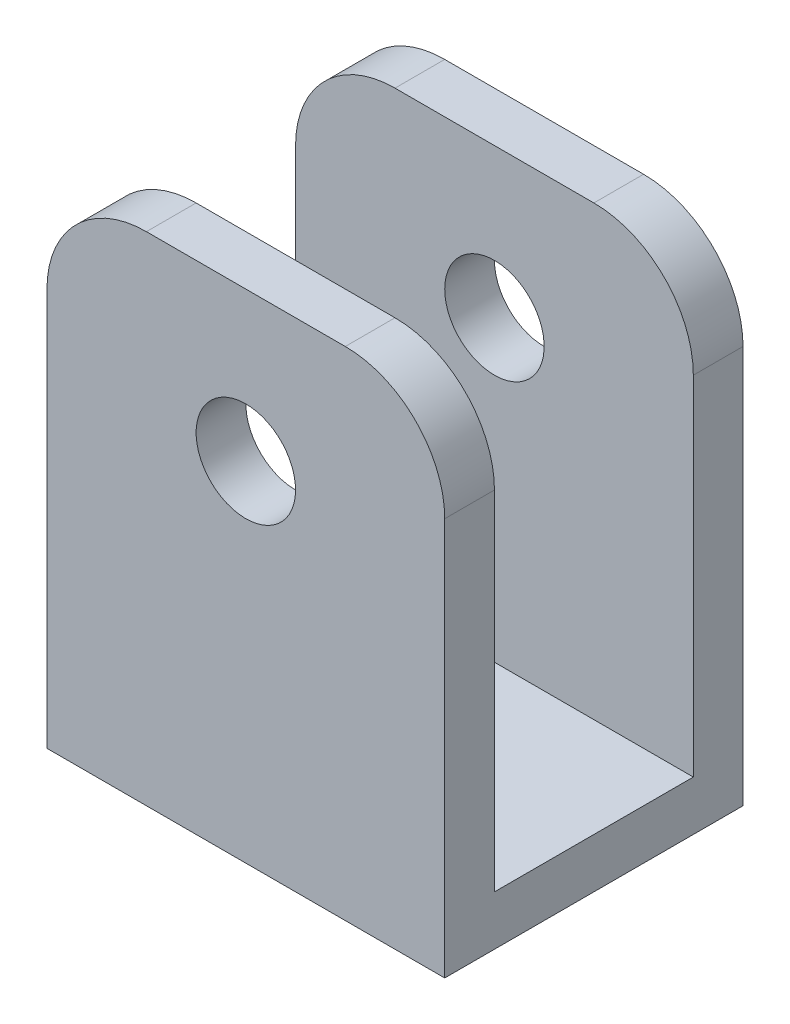
ISO-10303-21;
HEADER;
FILE_DESCRIPTION(('STEP AP214'),'2;1');
FILE_NAME('part.step','',(''),(''),'','','');
FILE_SCHEMA(('AUTOMOTIVE_DESIGN { 1 0 10303 214 1 1 1 1 }'));
ENDSEC;
DATA;
#1=APPLICATION_CONTEXT('core data for automotive mechanical design processes');
#2=APPLICATION_PROTOCOL_DEFINITION('international standard','automotive_design',2000,#1);
#3=PRODUCT_CONTEXT('',#1,'mechanical');
#4=PRODUCT('Part','Part','',(#3));
#5=PRODUCT_RELATED_PRODUCT_CATEGORY('part','',(#4));
#6=PRODUCT_DEFINITION_FORMATION('','',#4);
#7=PRODUCT_DEFINITION_CONTEXT('part definition',#1,'design');
#8=PRODUCT_DEFINITION('design','',#6,#7);
#9=PRODUCT_DEFINITION_SHAPE('','',#8);
#10=(LENGTH_UNIT() NAMED_UNIT(*) SI_UNIT(.MILLI.,.METRE.));
#11=(NAMED_UNIT(*) PLANE_ANGLE_UNIT() SI_UNIT($,.RADIAN.));
#12=(NAMED_UNIT(*) SI_UNIT($,.STERADIAN.) SOLID_ANGLE_UNIT());
#13=UNCERTAINTY_MEASURE_WITH_UNIT(LENGTH_MEASURE(1.E-05),#10,'distance_accuracy_value','');
#14=(GEOMETRIC_REPRESENTATION_CONTEXT(3) GLOBAL_UNCERTAINTY_ASSIGNED_CONTEXT((#13)) GLOBAL_UNIT_ASSIGNED_CONTEXT((#10,
#11,#12)) REPRESENTATION_CONTEXT('',''));
#15=CARTESIAN_POINT('',(0.,0.,0.));
#16=DIRECTION('',(0.,0.,1.));
#17=DIRECTION('',(1.,0.,0.));
#18=AXIS2_PLACEMENT_3D('',#15,#16,#17);
#19=CARTESIAN_POINT('',(-10.,5.,5.));
#20=DIRECTION('',(0.,0.,-1.));
#21=DIRECTION('',(-1.,0.,0.));
#22=AXIS2_PLACEMENT_3D('',#19,#20,#21);
#23=PLANE('',#22);
#24=DIRECTION('',(0.,-1.,0.));
#25=VECTOR('',#24,1.);
#26=CARTESIAN_POINT('',(-20.,-35.,5.));
#27=LINE('',#26,#25);
#28=CARTESIAN_POINT('',(-20.,5.,5.));
#29=VERTEX_POINT('',#28);
#30=CARTESIAN_POINT('',(-20.,-35.,5.));
#31=VERTEX_POINT('',#30);
#32=EDGE_CURVE('E139',#29,#31,#27,.T.);
#33=ORIENTED_EDGE('',*,*,#32,.T.);
#34=DIRECTION('',(1.,0.,0.));
#35=VECTOR('',#34,1.);
#36=CARTESIAN_POINT('',(-20.,-35.,5.));
#37=LINE('',#36,#35);
#38=CARTESIAN_POINT('',(20.,-35.,5.));
#39=VERTEX_POINT('',#38);
#40=EDGE_CURVE('E92',#31,#39,#37,.T.);
#41=ORIENTED_EDGE('',*,*,#40,.T.);
#42=DIRECTION('',(0.,1.,0.));
#43=VECTOR('',#42,1.);
#44=CARTESIAN_POINT('',(20.,-35.,5.));
#45=LINE('',#44,#43);
#46=CARTESIAN_POINT('',(20.,5.,5.));
#47=VERTEX_POINT('',#46);
#48=EDGE_CURVE('E109',#39,#47,#45,.T.);
#49=ORIENTED_EDGE('',*,*,#48,.T.);
#50=CARTESIAN_POINT('',(10.,5.,5.));
#51=DIRECTION('',(0.,0.,1.));
#52=DIRECTION('',(-1.,0.,0.));
#53=AXIS2_PLACEMENT_3D('',#50,#51,#52);
#54=CIRCLE('',#53,10.);
#55=CARTESIAN_POINT('',(10.,15.,5.));
#56=VERTEX_POINT('',#55);
#57=EDGE_CURVE('E102',#47,#56,#54,.T.);
#58=ORIENTED_EDGE('',*,*,#57,.T.);
#59=DIRECTION('',(-1.,0.,0.));
#60=VECTOR('',#59,1.);
#61=CARTESIAN_POINT('',(-10.,15.,5.));
#62=LINE('',#61,#60);
#63=CARTESIAN_POINT('',(-10.,15.,5.));
#64=VERTEX_POINT('',#63);
#65=EDGE_CURVE('E106',#56,#64,#62,.T.);
#66=ORIENTED_EDGE('',*,*,#65,.T.);
#67=CARTESIAN_POINT('',(-10.,5.,5.));
#68=DIRECTION('',(0.,0.,1.));
#69=DIRECTION('',(-1.,0.,0.));
#70=AXIS2_PLACEMENT_3D('',#67,#68,#69);
#71=CIRCLE('',#70,10.);
#72=EDGE_CURVE('E63',#64,#29,#71,.T.);
#73=ORIENTED_EDGE('',*,*,#72,.T.);
#74=EDGE_LOOP('',(#33,#41,#49,#58,#66,#73));
#75=FACE_BOUND('',#74,.T.);
#76=CARTESIAN_POINT('',(0.,0.,5.));
#77=DIRECTION('',(0.,0.,1.));
#78=DIRECTION('',(1.,0.,0.));
#79=AXIS2_PLACEMENT_3D('',#76,#77,#78);
#80=CIRCLE('',#79,5.);
#81=CARTESIAN_POINT('',(5.,0.,5.));
#82=VERTEX_POINT('',#81);
#83=EDGE_CURVE('E133',#82,#82,#80,.T.);
#84=ORIENTED_EDGE('',*,*,#83,.F.);
#85=EDGE_LOOP('',(#84));
#86=FACE_BOUND('',#85,.T.);
#87=ADVANCED_FACE('F39',(#75,#86),#23,.F.);
#88=CARTESIAN_POINT('',(-10.,5.,0.));
#89=DIRECTION('',(0.,0.,-1.));
#90=DIRECTION('',(-1.,0.,0.));
#91=AXIS2_PLACEMENT_3D('',#88,#89,#90);
#92=PLANE('',#91);
#93=DIRECTION('',(1.,0.,0.));
#94=VECTOR('',#93,1.);
#95=CARTESIAN_POINT('',(20.,-30.,0.));
#96=LINE('',#95,#94);
#97=CARTESIAN_POINT('',(-20.,-30.,0.));
#98=VERTEX_POINT('',#97);
#99=CARTESIAN_POINT('',(20.,-30.,0.));
#100=VERTEX_POINT('',#99);
#101=EDGE_CURVE('E54',#98,#100,#96,.T.);
#102=ORIENTED_EDGE('',*,*,#101,.F.);
#103=DIRECTION('',(0.,-1.,0.));
#104=VECTOR('',#103,1.);
#105=CARTESIAN_POINT('',(-20.,-35.,0.));
#106=LINE('',#105,#104);
#107=CARTESIAN_POINT('',(-20.,5.,0.));
#108=VERTEX_POINT('',#107);
#109=EDGE_CURVE('E130',#108,#98,#106,.T.);
#110=ORIENTED_EDGE('',*,*,#109,.F.);
#111=CARTESIAN_POINT('',(-10.,5.,0.));
#112=DIRECTION('',(0.,0.,1.));
#113=DIRECTION('',(-1.,0.,0.));
#114=AXIS2_PLACEMENT_3D('',#111,#112,#113);
#115=CIRCLE('',#114,10.);
#116=CARTESIAN_POINT('',(-10.,15.,0.));
#117=VERTEX_POINT('',#116);
#118=EDGE_CURVE('E84',#117,#108,#115,.T.);
#119=ORIENTED_EDGE('',*,*,#118,.F.);
#120=DIRECTION('',(-1.,0.,0.));
#121=VECTOR('',#120,1.);
#122=CARTESIAN_POINT('',(-10.,15.,0.));
#123=LINE('',#122,#121);
#124=CARTESIAN_POINT('',(10.,15.,0.));
#125=VERTEX_POINT('',#124);
#126=EDGE_CURVE('E136',#125,#117,#123,.T.);
#127=ORIENTED_EDGE('',*,*,#126,.F.);
#128=CARTESIAN_POINT('',(10.,5.,0.));
#129=DIRECTION('',(0.,0.,1.));
#130=DIRECTION('',(-1.,0.,0.));
#131=AXIS2_PLACEMENT_3D('',#128,#129,#130);
#132=CIRCLE('',#131,10.);
#133=CARTESIAN_POINT('',(20.,5.,0.));
#134=VERTEX_POINT('',#133);
#135=EDGE_CURVE('E118',#134,#125,#132,.T.);
#136=ORIENTED_EDGE('',*,*,#135,.F.);
#137=DIRECTION('',(0.,1.,0.));
#138=VECTOR('',#137,1.);
#139=CARTESIAN_POINT('',(20.,-35.,0.));
#140=LINE('',#139,#138);
#141=EDGE_CURVE('E132',#100,#134,#140,.T.);
#142=ORIENTED_EDGE('',*,*,#141,.F.);
#143=EDGE_LOOP('',(#102,#110,#119,#127,#136,#142));
#144=FACE_BOUND('',#143,.T.);
#145=CARTESIAN_POINT('',(0.,0.,0.));
#146=DIRECTION('',(0.,0.,1.));
#147=DIRECTION('',(1.,0.,0.));
#148=AXIS2_PLACEMENT_3D('',#145,#146,#147);
#149=CIRCLE('',#148,5.);
#150=CARTESIAN_POINT('',(5.,0.,0.));
#151=VERTEX_POINT('',#150);
#152=EDGE_CURVE('E220',#151,#151,#149,.T.);
#153=ORIENTED_EDGE('',*,*,#152,.T.);
#154=EDGE_LOOP('',(#153));
#155=FACE_BOUND('',#154,.T.);
#156=ADVANCED_FACE('F254',(#144,#155),#92,.T.);
#157=CARTESIAN_POINT('',(-20.,-35.,5.));
#158=DIRECTION('',(1.,0.,0.));
#159=DIRECTION('',(0.,1.,0.));
#160=AXIS2_PLACEMENT_3D('',#157,#158,#159);
#161=PLANE('',#160);
#162=ORIENTED_EDGE('',*,*,#109,.T.);
#163=DIRECTION('',(0.,0.,1.));
#164=VECTOR('',#163,1.);
#165=CARTESIAN_POINT('',(-20.,-30.,-20.));
#166=LINE('',#165,#164);
#167=CARTESIAN_POINT('',(-20.,-30.,-20.));
#168=VERTEX_POINT('',#167);
#169=EDGE_CURVE('E217',#168,#98,#166,.T.);
#170=ORIENTED_EDGE('',*,*,#169,.F.);
#171=DIRECTION('',(0.,-1.,0.));
#172=VECTOR('',#171,1.);
#173=CARTESIAN_POINT('',(-20.,0.,-20.));
#174=LINE('',#173,#172);
#175=CARTESIAN_POINT('',(-20.,4.99999999999993,-20.));
#176=VERTEX_POINT('',#175);
#177=EDGE_CURVE('E191',#176,#168,#174,.T.);
#178=ORIENTED_EDGE('',*,*,#177,.F.);
#179=DIRECTION('',(0.,0.,1.));
#180=VECTOR('',#179,1.);
#181=CARTESIAN_POINT('',(-20.,4.99999999999993,-25.));
#182=LINE('',#181,#180);
#183=CARTESIAN_POINT('',(-20.,4.99999999999993,-25.));
#184=VERTEX_POINT('',#183);
#185=EDGE_CURVE('E205',#184,#176,#182,.T.);
#186=ORIENTED_EDGE('',*,*,#185,.F.);
#187=DIRECTION('',(0.,-1.,0.));
#188=VECTOR('',#187,1.);
#189=CARTESIAN_POINT('',(-20.,0.,-25.));
#190=LINE('',#189,#188);
#191=CARTESIAN_POINT('',(-20.,-35.,-25.));
#192=VERTEX_POINT('',#191);
#193=EDGE_CURVE('E162',#184,#192,#190,.T.);
#194=ORIENTED_EDGE('',*,*,#193,.T.);
#195=DIRECTION('',(0.,0.,-1.));
#196=VECTOR('',#195,1.);
#197=CARTESIAN_POINT('',(-20.,-35.,5.));
#198=LINE('',#197,#196);
#199=EDGE_CURVE('E11',#31,#192,#198,.T.);
#200=ORIENTED_EDGE('',*,*,#199,.F.);
#201=ORIENTED_EDGE('',*,*,#32,.F.);
#202=DIRECTION('',(0.,0.,-1.));
#203=VECTOR('',#202,1.);
#204=CARTESIAN_POINT('',(-20.,5.,5.));
#205=LINE('',#204,#203);
#206=EDGE_CURVE('E126',#29,#108,#205,.T.);
#207=ORIENTED_EDGE('',*,*,#206,.T.);
#208=EDGE_LOOP('',(#162,#170,#178,#186,#194,#200,#201,#207));
#209=FACE_BOUND('',#208,.T.);
#210=ADVANCED_FACE('F41',(#209),#161,.F.);
#211=CARTESIAN_POINT('',(-20.,-35.,5.));
#212=DIRECTION('',(0.,1.,0.));
#213=DIRECTION('',(0.,0.,1.));
#214=AXIS2_PLACEMENT_3D('',#211,#212,#213);
#215=PLANE('',#214);
#216=CARTESIAN_POINT('',(7.,-35.,-10.));
#217=DIRECTION('',(0.,1.,0.));
#218=DIRECTION('',(0.,0.,1.));
#219=AXIS2_PLACEMENT_3D('',#216,#217,#218);
#220=CIRCLE('',#219,2.);
#221=CARTESIAN_POINT('',(7.,-35.,-8.));
#222=VERTEX_POINT('',#221);
#223=EDGE_CURVE('E322',#222,#222,#220,.T.);
#224=ORIENTED_EDGE('',*,*,#223,.T.);
#225=EDGE_LOOP('',(#224));
#226=FACE_BOUND('',#225,.T.);
#227=CARTESIAN_POINT('',(-7.,-35.,-10.));
#228=DIRECTION('',(0.,1.,0.));
#229=DIRECTION('',(0.,0.,1.));
#230=AXIS2_PLACEMENT_3D('',#227,#228,#229);
#231=CIRCLE('',#230,2.);
#232=CARTESIAN_POINT('',(-7.,-35.,-8.));
#233=VERTEX_POINT('',#232);
#234=EDGE_CURVE('E185',#233,#233,#231,.T.);
#235=ORIENTED_EDGE('',*,*,#234,.T.);
#236=EDGE_LOOP('',(#235));
#237=FACE_BOUND('',#236,.T.);
#238=ORIENTED_EDGE('',*,*,#199,.T.);
#239=DIRECTION('',(-1.,0.,0.));
#240=VECTOR('',#239,1.);
#241=CARTESIAN_POINT('',(0.,-35.,-25.));
#242=LINE('',#241,#240);
#243=CARTESIAN_POINT('',(20.,-35.,-25.));
#244=VERTEX_POINT('',#243);
#245=EDGE_CURVE('E156',#244,#192,#242,.T.);
#246=ORIENTED_EDGE('',*,*,#245,.F.);
#247=DIRECTION('',(0.,0.,-1.));
#248=VECTOR('',#247,1.);
#249=CARTESIAN_POINT('',(20.,-35.,5.));
#250=LINE('',#249,#248);
#251=EDGE_CURVE('E47',#39,#244,#250,.T.);
#252=ORIENTED_EDGE('',*,*,#251,.F.);
#253=ORIENTED_EDGE('',*,*,#40,.F.);
#254=EDGE_LOOP('',(#238,#246,#252,#253));
#255=FACE_BOUND('',#254,.T.);
#256=ADVANCED_FACE('F157',(#226,#237,#255),#215,.F.);
#257=CARTESIAN_POINT('',(20.,-35.,5.));
#258=DIRECTION('',(-1.,0.,0.));
#259=DIRECTION('',(0.,-1.,0.));
#260=AXIS2_PLACEMENT_3D('',#257,#258,#259);
#261=PLANE('',#260);
#262=ORIENTED_EDGE('',*,*,#251,.T.);
#263=DIRECTION('',(0.,-1.,0.));
#264=VECTOR('',#263,1.);
#265=CARTESIAN_POINT('',(20.,0.,-25.));
#266=LINE('',#265,#264);
#267=CARTESIAN_POINT('',(20.,4.99999999999993,-25.));
#268=VERTEX_POINT('',#267);
#269=EDGE_CURVE('E151',#268,#244,#266,.T.);
#270=ORIENTED_EDGE('',*,*,#269,.F.);
#271=DIRECTION('',(0.,0.,1.));
#272=VECTOR('',#271,1.);
#273=CARTESIAN_POINT('',(20.,4.99999999999993,-25.));
#274=LINE('',#273,#272);
#275=CARTESIAN_POINT('',(20.,4.99999999999993,-20.));
#276=VERTEX_POINT('',#275);
#277=EDGE_CURVE('E208',#268,#276,#274,.T.);
#278=ORIENTED_EDGE('',*,*,#277,.T.);
#279=DIRECTION('',(0.,-1.,0.));
#280=VECTOR('',#279,1.);
#281=CARTESIAN_POINT('',(20.,0.,-20.));
#282=LINE('',#281,#280);
#283=CARTESIAN_POINT('',(20.,-30.,-20.));
#284=VERTEX_POINT('',#283);
#285=EDGE_CURVE('E188',#276,#284,#282,.T.);
#286=ORIENTED_EDGE('',*,*,#285,.T.);
#287=DIRECTION('',(0.,0.,1.));
#288=VECTOR('',#287,1.);
#289=CARTESIAN_POINT('',(20.,-30.,-20.));
#290=LINE('',#289,#288);
#291=EDGE_CURVE('E213',#284,#100,#290,.T.);
#292=ORIENTED_EDGE('',*,*,#291,.T.);
#293=ORIENTED_EDGE('',*,*,#141,.T.);
#294=DIRECTION('',(0.,0.,-1.));
#295=VECTOR('',#294,1.);
#296=CARTESIAN_POINT('',(20.,5.,5.));
#297=LINE('',#296,#295);
#298=EDGE_CURVE('E121',#47,#134,#297,.T.);
#299=ORIENTED_EDGE('',*,*,#298,.F.);
#300=ORIENTED_EDGE('',*,*,#48,.F.);
#301=EDGE_LOOP('',(#262,#270,#278,#286,#292,#293,#299,#300));
#302=FACE_BOUND('',#301,.T.);
#303=ADVANCED_FACE('F147',(#302),#261,.F.);
#304=CARTESIAN_POINT('',(10.,5.,5.));
#305=DIRECTION('',(0.,0.,-1.));
#306=DIRECTION('',(-1.,0.,0.));
#307=AXIS2_PLACEMENT_3D('',#304,#305,#306);
#308=CYLINDRICAL_SURFACE('',#307,10.);
#309=ORIENTED_EDGE('',*,*,#135,.T.);
#310=DIRECTION('',(0.,0.,-1.));
#311=VECTOR('',#310,1.);
#312=CARTESIAN_POINT('',(10.,15.,5.));
#313=LINE('',#312,#311);
#314=EDGE_CURVE('E115',#56,#125,#313,.T.);
#315=ORIENTED_EDGE('',*,*,#314,.F.);
#316=ORIENTED_EDGE('',*,*,#57,.F.);
#317=ORIENTED_EDGE('',*,*,#298,.T.);
#318=EDGE_LOOP('',(#309,#315,#316,#317));
#319=FACE_BOUND('',#318,.T.);
#320=ADVANCED_FACE('F116',(#319),#308,.T.);
#321=CARTESIAN_POINT('',(-10.,15.,5.));
#322=DIRECTION('',(0.,-1.,0.));
#323=DIRECTION('',(1.,0.,0.));
#324=AXIS2_PLACEMENT_3D('',#321,#322,#323);
#325=PLANE('',#324);
#326=ORIENTED_EDGE('',*,*,#126,.T.);
#327=DIRECTION('',(0.,0.,-1.));
#328=VECTOR('',#327,1.);
#329=CARTESIAN_POINT('',(-10.,15.,5.));
#330=LINE('',#329,#328);
#331=EDGE_CURVE('E122',#64,#117,#330,.T.);
#332=ORIENTED_EDGE('',*,*,#331,.F.);
#333=ORIENTED_EDGE('',*,*,#65,.F.);
#334=ORIENTED_EDGE('',*,*,#314,.T.);
#335=EDGE_LOOP('',(#326,#332,#333,#334));
#336=FACE_BOUND('',#335,.T.);
#337=ADVANCED_FACE('F124',(#336),#325,.F.);
#338=CARTESIAN_POINT('',(-10.,5.,5.));
#339=DIRECTION('',(0.,0.,-1.));
#340=DIRECTION('',(-1.,0.,0.));
#341=AXIS2_PLACEMENT_3D('',#338,#339,#340);
#342=CYLINDRICAL_SURFACE('',#341,10.);
#343=ORIENTED_EDGE('',*,*,#118,.T.);
#344=ORIENTED_EDGE('',*,*,#206,.F.);
#345=ORIENTED_EDGE('',*,*,#72,.F.);
#346=ORIENTED_EDGE('',*,*,#331,.T.);
#347=EDGE_LOOP('',(#343,#344,#345,#346));
#348=FACE_BOUND('',#347,.T.);
#349=ADVANCED_FACE('F269',(#348),#342,.T.);
#350=CARTESIAN_POINT('',(0.,0.,5.));
#351=DIRECTION('',(0.,0.,-1.));
#352=DIRECTION('',(-1.,0.,0.));
#353=AXIS2_PLACEMENT_3D('',#350,#351,#352);
#354=CYLINDRICAL_SURFACE('',#353,5.);
#355=ORIENTED_EDGE('',*,*,#83,.T.);
#356=EDGE_LOOP('',(#355));
#357=FACE_BOUND('',#356,.T.);
#358=ORIENTED_EDGE('',*,*,#152,.F.);
#359=EDGE_LOOP('',(#358));
#360=FACE_BOUND('',#359,.T.);
#361=ADVANCED_FACE('F271',(#357,#360),#354,.F.);
#362=CARTESIAN_POINT('',(20.,-30.,-20.));
#363=DIRECTION('',(0.,-1.,0.));
#364=DIRECTION('',(0.,0.,-1.));
#365=AXIS2_PLACEMENT_3D('',#362,#363,#364);
#366=PLANE('',#365);
#367=CARTESIAN_POINT('',(7.,-30.,-10.));
#368=DIRECTION('',(0.,1.,0.));
#369=DIRECTION('',(0.,0.,1.));
#370=AXIS2_PLACEMENT_3D('',#367,#368,#369);
#371=CIRCLE('',#370,2.);
#372=CARTESIAN_POINT('',(7.,-30.,-8.));
#373=VERTEX_POINT('',#372);
#374=EDGE_CURVE('E319',#373,#373,#371,.T.);
#375=ORIENTED_EDGE('',*,*,#374,.F.);
#376=EDGE_LOOP('',(#375));
#377=FACE_BOUND('',#376,.T.);
#378=CARTESIAN_POINT('',(-7.,-30.,-10.));
#379=DIRECTION('',(0.,1.,0.));
#380=DIRECTION('',(0.,0.,1.));
#381=AXIS2_PLACEMENT_3D('',#378,#379,#380);
#382=CIRCLE('',#381,2.);
#383=CARTESIAN_POINT('',(-7.,-30.,-8.));
#384=VERTEX_POINT('',#383);
#385=EDGE_CURVE('E324',#384,#384,#382,.T.);
#386=ORIENTED_EDGE('',*,*,#385,.F.);
#387=EDGE_LOOP('',(#386));
#388=FACE_BOUND('',#387,.T.);
#389=ORIENTED_EDGE('',*,*,#101,.T.);
#390=ORIENTED_EDGE('',*,*,#291,.F.);
#391=DIRECTION('',(1.,0.,0.));
#392=VECTOR('',#391,1.);
#393=CARTESIAN_POINT('',(20.,-30.,-20.));
#394=LINE('',#393,#392);
#395=EDGE_CURVE('E210',#168,#284,#394,.T.);
#396=ORIENTED_EDGE('',*,*,#395,.F.);
#397=ORIENTED_EDGE('',*,*,#169,.T.);
#398=EDGE_LOOP('',(#389,#390,#396,#397));
#399=FACE_BOUND('',#398,.T.);
#400=ADVANCED_FACE('F256',(#377,#388,#399),#366,.F.);
#401=CARTESIAN_POINT('',(0.,0.,-20.));
#402=DIRECTION('',(0.,0.,-1.));
#403=DIRECTION('',(-1.,0.,0.));
#404=AXIS2_PLACEMENT_3D('',#401,#402,#403);
#405=PLANE('',#404);
#406=CARTESIAN_POINT('',(0.,0.,-20.));
#407=DIRECTION('',(0.,0.,-1.));
#408=DIRECTION('',(-1.,0.,0.));
#409=AXIS2_PLACEMENT_3D('',#406,#407,#408);
#410=CIRCLE('',#409,5.);
#411=CARTESIAN_POINT('',(-5.,0.,-20.));
#412=VERTEX_POINT('',#411);
#413=EDGE_CURVE('E181',#412,#412,#410,.T.);
#414=ORIENTED_EDGE('',*,*,#413,.T.);
#415=EDGE_LOOP('',(#414));
#416=FACE_BOUND('',#415,.T.);
#417=ORIENTED_EDGE('',*,*,#177,.T.);
#418=ORIENTED_EDGE('',*,*,#395,.T.);
#419=ORIENTED_EDGE('',*,*,#285,.F.);
#420=CARTESIAN_POINT('',(10.,5.,-20.));
#421=DIRECTION('',(0.,0.,-1.));
#422=DIRECTION('',(-1.,0.,0.));
#423=AXIS2_PLACEMENT_3D('',#420,#421,#422);
#424=CIRCLE('',#423,10.);
#425=CARTESIAN_POINT('',(9.99999999999993,15.,-20.));
#426=VERTEX_POINT('',#425);
#427=EDGE_CURVE('E184',#276,#426,#424,.F.);
#428=ORIENTED_EDGE('',*,*,#427,.T.);
#429=DIRECTION('',(-1.,0.,0.));
#430=VECTOR('',#429,1.);
#431=CARTESIAN_POINT('',(0.,15.,-20.));
#432=LINE('',#431,#430);
#433=CARTESIAN_POINT('',(-9.99999999999993,15.,-20.));
#434=VERTEX_POINT('',#433);
#435=EDGE_CURVE('E197',#426,#434,#432,.T.);
#436=ORIENTED_EDGE('',*,*,#435,.T.);
#437=CARTESIAN_POINT('',(-10.,5.,-20.));
#438=DIRECTION('',(0.,0.,-1.));
#439=DIRECTION('',(-1.,0.,0.));
#440=AXIS2_PLACEMENT_3D('',#437,#438,#439);
#441=CIRCLE('',#440,10.);
#442=EDGE_CURVE('E194',#176,#434,#441,.T.);
#443=ORIENTED_EDGE('',*,*,#442,.F.);
#444=EDGE_LOOP('',(#417,#418,#419,#428,#436,#443));
#445=FACE_BOUND('',#444,.T.);
#446=ADVANCED_FACE('F261',(#416,#445),#405,.F.);
#447=CARTESIAN_POINT('',(10.,5.,-25.));
#448=DIRECTION('',(0.,0.,1.));
#449=DIRECTION('',(1.,0.,0.));
#450=AXIS2_PLACEMENT_3D('',#447,#448,#449);
#451=CYLINDRICAL_SURFACE('',#450,10.);
#452=ORIENTED_EDGE('',*,*,#427,.F.);
#453=ORIENTED_EDGE('',*,*,#277,.F.);
#454=CARTESIAN_POINT('',(10.,5.,-25.));
#455=DIRECTION('',(0.,0.,-1.));
#456=DIRECTION('',(-1.,0.,0.));
#457=AXIS2_PLACEMENT_3D('',#454,#455,#456);
#458=CIRCLE('',#457,10.);
#459=CARTESIAN_POINT('',(9.99999999999993,15.,-25.));
#460=VERTEX_POINT('',#459);
#461=EDGE_CURVE('E167',#268,#460,#458,.F.);
#462=ORIENTED_EDGE('',*,*,#461,.T.);
#463=DIRECTION('',(0.,0.,1.));
#464=VECTOR('',#463,1.);
#465=CARTESIAN_POINT('',(9.99999999999993,15.,-25.));
#466=LINE('',#465,#464);
#467=EDGE_CURVE('E180',#460,#426,#466,.T.);
#468=ORIENTED_EDGE('',*,*,#467,.T.);
#469=EDGE_LOOP('',(#452,#453,#462,#468));
#470=FACE_BOUND('',#469,.T.);
#471=ADVANCED_FACE('F264',(#470),#451,.T.);
#472=CARTESIAN_POINT('',(-10.,5.,-25.));
#473=DIRECTION('',(0.,0.,1.));
#474=DIRECTION('',(1.,0.,0.));
#475=AXIS2_PLACEMENT_3D('',#472,#473,#474);
#476=CYLINDRICAL_SURFACE('',#475,10.);
#477=ORIENTED_EDGE('',*,*,#442,.T.);
#478=DIRECTION('',(0.,0.,1.));
#479=VECTOR('',#478,1.);
#480=CARTESIAN_POINT('',(-9.99999999999993,15.,-25.));
#481=LINE('',#480,#479);
#482=CARTESIAN_POINT('',(-9.99999999999993,15.,-25.));
#483=VERTEX_POINT('',#482);
#484=EDGE_CURVE('E202',#483,#434,#481,.T.);
#485=ORIENTED_EDGE('',*,*,#484,.F.);
#486=CARTESIAN_POINT('',(-10.,5.,-25.));
#487=DIRECTION('',(0.,0.,-1.));
#488=DIRECTION('',(-1.,0.,0.));
#489=AXIS2_PLACEMENT_3D('',#486,#487,#488);
#490=CIRCLE('',#489,10.);
#491=EDGE_CURVE('E174',#184,#483,#490,.T.);
#492=ORIENTED_EDGE('',*,*,#491,.F.);
#493=ORIENTED_EDGE('',*,*,#185,.T.);
#494=EDGE_LOOP('',(#477,#485,#492,#493));
#495=FACE_BOUND('',#494,.T.);
#496=ADVANCED_FACE('F293',(#495),#476,.T.);
#497=CARTESIAN_POINT('',(0.,0.,-25.));
#498=DIRECTION('',(0.,0.,1.));
#499=DIRECTION('',(1.,0.,0.));
#500=AXIS2_PLACEMENT_3D('',#497,#498,#499);
#501=CYLINDRICAL_SURFACE('',#500,5.);
#502=CARTESIAN_POINT('',(0.,0.,-25.));
#503=DIRECTION('',(0.,0.,-1.));
#504=DIRECTION('',(-1.,0.,0.));
#505=AXIS2_PLACEMENT_3D('',#502,#503,#504);
#506=CIRCLE('',#505,5.);
#507=CARTESIAN_POINT('',(-5.,0.,-25.));
#508=VERTEX_POINT('',#507);
#509=EDGE_CURVE('E169',#508,#508,#506,.T.);
#510=ORIENTED_EDGE('',*,*,#509,.T.);
#511=EDGE_LOOP('',(#510));
#512=FACE_BOUND('',#511,.T.);
#513=ORIENTED_EDGE('',*,*,#413,.F.);
#514=EDGE_LOOP('',(#513));
#515=FACE_BOUND('',#514,.T.);
#516=ADVANCED_FACE('F290',(#512,#515),#501,.F.);
#517=CARTESIAN_POINT('',(0.,15.,-25.));
#518=DIRECTION('',(0.,1.,0.));
#519=DIRECTION('',(-1.,0.,0.));
#520=AXIS2_PLACEMENT_3D('',#517,#518,#519);
#521=PLANE('',#520);
#522=ORIENTED_EDGE('',*,*,#435,.F.);
#523=ORIENTED_EDGE('',*,*,#467,.F.);
#524=DIRECTION('',(-1.,0.,0.));
#525=VECTOR('',#524,1.);
#526=CARTESIAN_POINT('',(0.,15.,-25.));
#527=LINE('',#526,#525);
#528=EDGE_CURVE('E177',#460,#483,#527,.T.);
#529=ORIENTED_EDGE('',*,*,#528,.T.);
#530=ORIENTED_EDGE('',*,*,#484,.T.);
#531=EDGE_LOOP('',(#522,#523,#529,#530));
#532=FACE_BOUND('',#531,.T.);
#533=ADVANCED_FACE('F266',(#532),#521,.T.);
#534=CARTESIAN_POINT('',(0.,0.,-25.));
#535=DIRECTION('',(0.,0.,-1.));
#536=DIRECTION('',(-1.,0.,0.));
#537=AXIS2_PLACEMENT_3D('',#534,#535,#536);
#538=PLANE('',#537);
#539=ORIENTED_EDGE('',*,*,#509,.F.);
#540=EDGE_LOOP('',(#539));
#541=FACE_BOUND('',#540,.T.);
#542=ORIENTED_EDGE('',*,*,#461,.F.);
#543=ORIENTED_EDGE('',*,*,#269,.T.);
#544=ORIENTED_EDGE('',*,*,#245,.T.);
#545=ORIENTED_EDGE('',*,*,#193,.F.);
#546=ORIENTED_EDGE('',*,*,#491,.T.);
#547=ORIENTED_EDGE('',*,*,#528,.F.);
#548=EDGE_LOOP('',(#542,#543,#544,#545,#546,#547));
#549=FACE_BOUND('',#548,.T.);
#550=ADVANCED_FACE('F164',(#541,#549),#538,.T.);
#551=CARTESIAN_POINT('',(-7.,-45.,-10.));
#552=DIRECTION('',(0.,1.,0.));
#553=DIRECTION('',(0.,0.,1.));
#554=AXIS2_PLACEMENT_3D('',#551,#552,#553);
#555=CYLINDRICAL_SURFACE('',#554,2.);
#556=ORIENTED_EDGE('',*,*,#385,.T.);
#557=EDGE_LOOP('',(#556));
#558=FACE_BOUND('',#557,.T.);
#559=ORIENTED_EDGE('',*,*,#234,.F.);
#560=EDGE_LOOP('',(#559));
#561=FACE_BOUND('',#560,.T.);
#562=ADVANCED_FACE('F306',(#558,#561),#555,.F.);
#563=CARTESIAN_POINT('',(7.,-45.,-10.));
#564=DIRECTION('',(0.,1.,0.));
#565=DIRECTION('',(0.,0.,1.));
#566=AXIS2_PLACEMENT_3D('',#563,#564,#565);
#567=CYLINDRICAL_SURFACE('',#566,2.);
#568=ORIENTED_EDGE('',*,*,#374,.T.);
#569=EDGE_LOOP('',(#568));
#570=FACE_BOUND('',#569,.T.);
#571=ORIENTED_EDGE('',*,*,#223,.F.);
#572=EDGE_LOOP('',(#571));
#573=FACE_BOUND('',#572,.T.);
#574=ADVANCED_FACE('F310',(#570,#573),#567,.F.);
#575=CLOSED_SHELL('',(#87,#156,#210,#256,#303,#320,#337,#349,#361,#400,#446,#471,#496,#516,#533,
#550,#562,#574));
#576=MANIFOLD_SOLID_BREP('B2',#575);
#577=ADVANCED_BREP_SHAPE_REPRESENTATION('',(#18,#576),#14);
#578=SHAPE_DEFINITION_REPRESENTATION(#9,#577);
ENDSEC;
END-ISO-10303-21;
